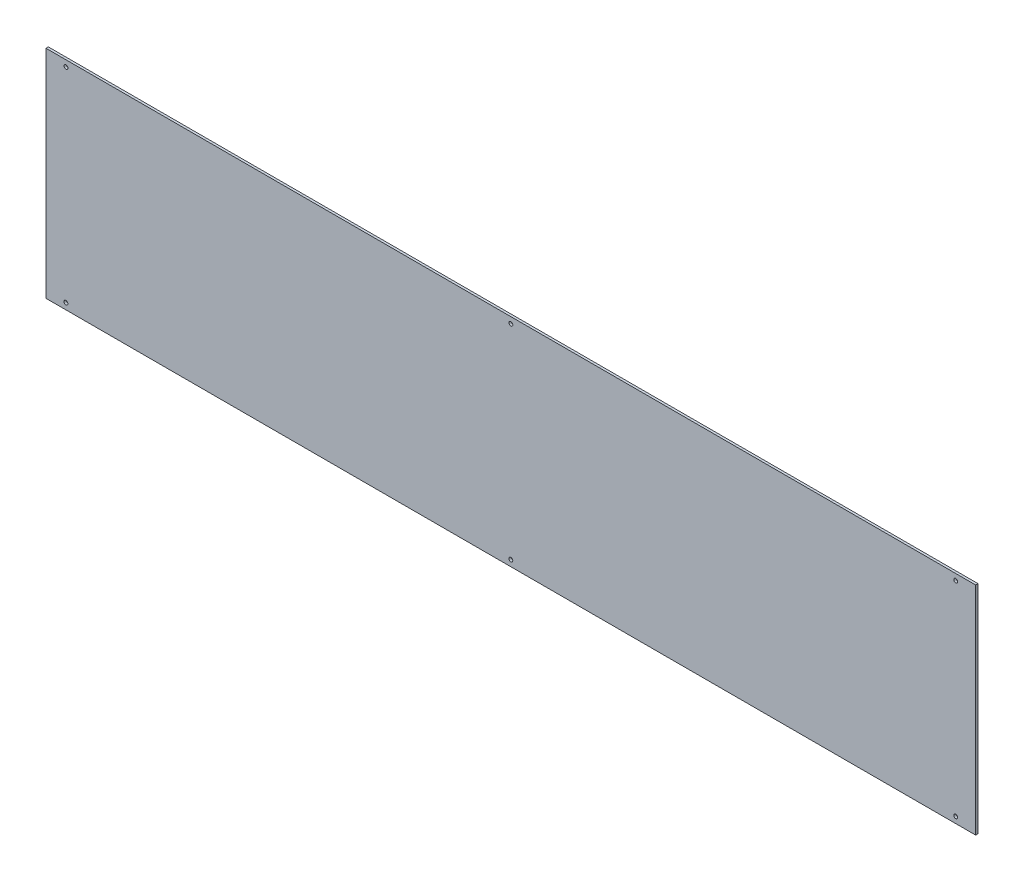
ISO-10303-21;
HEADER;
FILE_DESCRIPTION(('STEP AP214'),'2;1');
FILE_NAME('part.step','',(''),(''),'','','');
FILE_SCHEMA(('AUTOMOTIVE_DESIGN { 1 0 10303 214 1 1 1 1 }'));
ENDSEC;
DATA;
#1=APPLICATION_CONTEXT('core data for automotive mechanical design processes');
#2=APPLICATION_PROTOCOL_DEFINITION('international standard','automotive_design',2000,#1);
#3=PRODUCT_CONTEXT('',#1,'mechanical');
#4=PRODUCT('Part','Part','',(#3));
#5=PRODUCT_RELATED_PRODUCT_CATEGORY('part','',(#4));
#6=PRODUCT_DEFINITION_FORMATION('','',#4);
#7=PRODUCT_DEFINITION_CONTEXT('part definition',#1,'design');
#8=PRODUCT_DEFINITION('design','',#6,#7);
#9=PRODUCT_DEFINITION_SHAPE('','',#8);
#10=(LENGTH_UNIT() NAMED_UNIT(*) SI_UNIT(.MILLI.,.METRE.));
#11=(NAMED_UNIT(*) PLANE_ANGLE_UNIT() SI_UNIT($,.RADIAN.));
#12=(NAMED_UNIT(*) SI_UNIT($,.STERADIAN.) SOLID_ANGLE_UNIT());
#13=UNCERTAINTY_MEASURE_WITH_UNIT(LENGTH_MEASURE(1.E-05),#10,'distance_accuracy_value','');
#14=(GEOMETRIC_REPRESENTATION_CONTEXT(3) GLOBAL_UNCERTAINTY_ASSIGNED_CONTEXT((#13)) GLOBAL_UNIT_ASSIGNED_CONTEXT((#10,
#11,#12)) REPRESENTATION_CONTEXT('',''));
#15=CARTESIAN_POINT('',(0.,0.,0.));
#16=DIRECTION('',(0.,0.,1.));
#17=DIRECTION('',(1.,0.,0.));
#18=AXIS2_PLACEMENT_3D('',#15,#16,#17);
#19=CARTESIAN_POINT('',(-592.709,138.1125,0.));
#20=DIRECTION('',(0.,0.,1.));
#21=DIRECTION('',(1.,0.,0.));
#22=AXIS2_PLACEMENT_3D('',#19,#20,#21);
#23=PLANE('',#22);
#24=DIRECTION('',(1.,0.,0.));
#25=VECTOR('',#24,1.);
#26=CARTESIAN_POINT('',(592.709,138.1125,0.));
#27=LINE('',#26,#25);
#28=CARTESIAN_POINT('',(-592.709,138.1125,0.));
#29=VERTEX_POINT('',#28);
#30=CARTESIAN_POINT('',(592.709,138.1125,0.));
#31=VERTEX_POINT('',#30);
#32=EDGE_CURVE('E102',#29,#31,#27,.T.);
#33=ORIENTED_EDGE('',*,*,#32,.T.);
#34=DIRECTION('',(0.,1.,0.));
#35=VECTOR('',#34,1.);
#36=CARTESIAN_POINT('',(592.709,-138.1125,0.));
#37=LINE('',#36,#35);
#38=CARTESIAN_POINT('',(592.709,-138.1125,0.));
#39=VERTEX_POINT('',#38);
#40=EDGE_CURVE('E72',#31,#39,#37,.F.);
#41=ORIENTED_EDGE('',*,*,#40,.T.);
#42=DIRECTION('',(-1.,0.,0.));
#43=VECTOR('',#42,1.);
#44=CARTESIAN_POINT('',(592.709,-138.1125,0.));
#45=LINE('',#44,#43);
#46=CARTESIAN_POINT('',(-592.709,-138.1125,0.));
#47=VERTEX_POINT('',#46);
#48=EDGE_CURVE('E55',#39,#47,#45,.T.);
#49=ORIENTED_EDGE('',*,*,#48,.T.);
#50=DIRECTION('',(0.,1.,0.));
#51=VECTOR('',#50,1.);
#52=CARTESIAN_POINT('',(-592.709,-138.1125,0.));
#53=LINE('',#52,#51);
#54=EDGE_CURVE('E60',#47,#29,#53,.T.);
#55=ORIENTED_EDGE('',*,*,#54,.T.);
#56=EDGE_LOOP('',(#33,#41,#49,#55));
#57=FACE_BOUND('',#56,.T.);
#58=CARTESIAN_POINT('',(0.,130.175,0.));
#59=DIRECTION('',(0.,0.,1.));
#60=DIRECTION('',(1.,0.,0.));
#61=AXIS2_PLACEMENT_3D('',#58,#59,#60);
#62=CIRCLE('',#61,2.4892);
#63=CARTESIAN_POINT('',(2.4892,130.175,0.));
#64=VERTEX_POINT('',#63);
#65=EDGE_CURVE('E69',#64,#64,#62,.T.);
#66=ORIENTED_EDGE('',*,*,#65,.T.);
#67=EDGE_LOOP('',(#66));
#68=FACE_BOUND('',#67,.T.);
#69=CARTESIAN_POINT('',(0.,-130.175,0.));
#70=DIRECTION('',(0.,0.,1.));
#71=DIRECTION('',(1.,0.,0.));
#72=AXIS2_PLACEMENT_3D('',#69,#70,#71);
#73=CIRCLE('',#72,2.4892);
#74=CARTESIAN_POINT('',(2.4892,-130.175,0.));
#75=VERTEX_POINT('',#74);
#76=EDGE_CURVE('E105',#75,#75,#73,.T.);
#77=ORIENTED_EDGE('',*,*,#76,.T.);
#78=EDGE_LOOP('',(#77));
#79=FACE_BOUND('',#78,.T.);
#80=CARTESIAN_POINT('',(-567.309,-130.175,0.));
#81=DIRECTION('',(0.,0.,1.));
#82=DIRECTION('',(1.,0.,0.));
#83=AXIS2_PLACEMENT_3D('',#80,#81,#82);
#84=CIRCLE('',#83,2.48919999999997);
#85=CARTESIAN_POINT('',(-564.8198,-130.175,0.));
#86=VERTEX_POINT('',#85);
#87=EDGE_CURVE('E108',#86,#86,#84,.T.);
#88=ORIENTED_EDGE('',*,*,#87,.T.);
#89=EDGE_LOOP('',(#88));
#90=FACE_BOUND('',#89,.T.);
#91=CARTESIAN_POINT('',(567.309,-130.175,0.));
#92=DIRECTION('',(0.,0.,1.));
#93=DIRECTION('',(1.,0.,0.));
#94=AXIS2_PLACEMENT_3D('',#91,#92,#93);
#95=CIRCLE('',#94,2.48919999999997);
#96=CARTESIAN_POINT('',(569.7982,-130.175,0.));
#97=VERTEX_POINT('',#96);
#98=EDGE_CURVE('E111',#97,#97,#95,.T.);
#99=ORIENTED_EDGE('',*,*,#98,.T.);
#100=EDGE_LOOP('',(#99));
#101=FACE_BOUND('',#100,.T.);
#102=CARTESIAN_POINT('',(567.309,130.175,0.));
#103=DIRECTION('',(0.,0.,1.));
#104=DIRECTION('',(1.,0.,0.));
#105=AXIS2_PLACEMENT_3D('',#102,#103,#104);
#106=CIRCLE('',#105,2.48919999999997);
#107=CARTESIAN_POINT('',(569.7982,130.175,0.));
#108=VERTEX_POINT('',#107);
#109=EDGE_CURVE('E113',#108,#108,#106,.T.);
#110=ORIENTED_EDGE('',*,*,#109,.T.);
#111=EDGE_LOOP('',(#110));
#112=FACE_BOUND('',#111,.T.);
#113=CARTESIAN_POINT('',(-567.309,130.175,0.));
#114=DIRECTION('',(0.,0.,1.));
#115=DIRECTION('',(1.,0.,0.));
#116=AXIS2_PLACEMENT_3D('',#113,#114,#115);
#117=CIRCLE('',#116,2.48919999999997);
#118=CARTESIAN_POINT('',(-564.8198,130.175,0.));
#119=VERTEX_POINT('',#118);
#120=EDGE_CURVE('E20',#119,#119,#117,.T.);
#121=ORIENTED_EDGE('',*,*,#120,.T.);
#122=EDGE_LOOP('',(#121));
#123=FACE_BOUND('',#122,.T.);
#124=ADVANCED_FACE('F17',(#57,#68,#79,#90,#101,#112,#123),#23,.F.);
#125=CARTESIAN_POINT('',(-567.309,130.175,0.));
#126=DIRECTION('',(0.,0.,1.));
#127=DIRECTION('',(1.,0.,0.));
#128=AXIS2_PLACEMENT_3D('',#125,#126,#127);
#129=CYLINDRICAL_SURFACE('',#128,2.48919999999997);
#130=CARTESIAN_POINT('',(-567.309,130.175,2.9972));
#131=DIRECTION('',(0.,0.,1.));
#132=DIRECTION('',(1.,0.,0.));
#133=AXIS2_PLACEMENT_3D('',#130,#131,#132);
#134=CIRCLE('',#133,2.48919999999997);
#135=CARTESIAN_POINT('',(-564.8198,130.175,2.9972));
#136=VERTEX_POINT('',#135);
#137=EDGE_CURVE('E99',#136,#136,#134,.F.);
#138=ORIENTED_EDGE('',*,*,#137,.F.);
#139=EDGE_LOOP('',(#138));
#140=FACE_BOUND('',#139,.T.);
#141=ORIENTED_EDGE('',*,*,#120,.F.);
#142=EDGE_LOOP('',(#141));
#143=FACE_BOUND('',#142,.T.);
#144=ADVANCED_FACE('F121',(#140,#143),#129,.F.);
#145=CARTESIAN_POINT('',(567.309,130.175,0.));
#146=DIRECTION('',(0.,0.,1.));
#147=DIRECTION('',(1.,0.,0.));
#148=AXIS2_PLACEMENT_3D('',#145,#146,#147);
#149=CYLINDRICAL_SURFACE('',#148,2.48919999999997);
#150=CARTESIAN_POINT('',(567.309,130.175,2.9972));
#151=DIRECTION('',(0.,0.,1.));
#152=DIRECTION('',(1.,0.,0.));
#153=AXIS2_PLACEMENT_3D('',#150,#151,#152);
#154=CIRCLE('',#153,2.48919999999997);
#155=CARTESIAN_POINT('',(569.7982,130.175,2.9972));
#156=VERTEX_POINT('',#155);
#157=EDGE_CURVE('E96',#156,#156,#154,.F.);
#158=ORIENTED_EDGE('',*,*,#157,.F.);
#159=EDGE_LOOP('',(#158));
#160=FACE_BOUND('',#159,.T.);
#161=ORIENTED_EDGE('',*,*,#109,.F.);
#162=EDGE_LOOP('',(#161));
#163=FACE_BOUND('',#162,.T.);
#164=ADVANCED_FACE('F123',(#160,#163),#149,.F.);
#165=CARTESIAN_POINT('',(567.309,-130.175,0.));
#166=DIRECTION('',(0.,0.,1.));
#167=DIRECTION('',(1.,0.,0.));
#168=AXIS2_PLACEMENT_3D('',#165,#166,#167);
#169=CYLINDRICAL_SURFACE('',#168,2.48919999999997);
#170=CARTESIAN_POINT('',(567.309,-130.175,2.9972));
#171=DIRECTION('',(0.,0.,1.));
#172=DIRECTION('',(1.,0.,0.));
#173=AXIS2_PLACEMENT_3D('',#170,#171,#172);
#174=CIRCLE('',#173,2.48919999999997);
#175=CARTESIAN_POINT('',(569.7982,-130.175,2.9972));
#176=VERTEX_POINT('',#175);
#177=EDGE_CURVE('E93',#176,#176,#174,.F.);
#178=ORIENTED_EDGE('',*,*,#177,.F.);
#179=EDGE_LOOP('',(#178));
#180=FACE_BOUND('',#179,.T.);
#181=ORIENTED_EDGE('',*,*,#98,.F.);
#182=EDGE_LOOP('',(#181));
#183=FACE_BOUND('',#182,.T.);
#184=ADVANCED_FACE('F130',(#180,#183),#169,.F.);
#185=CARTESIAN_POINT('',(-567.309,-130.175,0.));
#186=DIRECTION('',(0.,0.,1.));
#187=DIRECTION('',(1.,0.,0.));
#188=AXIS2_PLACEMENT_3D('',#185,#186,#187);
#189=CYLINDRICAL_SURFACE('',#188,2.48919999999997);
#190=CARTESIAN_POINT('',(-567.309,-130.175,2.9972));
#191=DIRECTION('',(0.,0.,1.));
#192=DIRECTION('',(1.,0.,0.));
#193=AXIS2_PLACEMENT_3D('',#190,#191,#192);
#194=CIRCLE('',#193,2.48919999999997);
#195=CARTESIAN_POINT('',(-564.8198,-130.175,2.9972));
#196=VERTEX_POINT('',#195);
#197=EDGE_CURVE('E90',#196,#196,#194,.F.);
#198=ORIENTED_EDGE('',*,*,#197,.F.);
#199=EDGE_LOOP('',(#198));
#200=FACE_BOUND('',#199,.T.);
#201=ORIENTED_EDGE('',*,*,#87,.F.);
#202=EDGE_LOOP('',(#201));
#203=FACE_BOUND('',#202,.T.);
#204=ADVANCED_FACE('F161',(#200,#203),#189,.F.);
#205=CARTESIAN_POINT('',(0.,-130.175,0.));
#206=DIRECTION('',(0.,0.,1.));
#207=DIRECTION('',(1.,0.,0.));
#208=AXIS2_PLACEMENT_3D('',#205,#206,#207);
#209=CYLINDRICAL_SURFACE('',#208,2.4892);
#210=CARTESIAN_POINT('',(0.,-130.175,2.9972));
#211=DIRECTION('',(0.,0.,1.));
#212=DIRECTION('',(1.,0.,0.));
#213=AXIS2_PLACEMENT_3D('',#210,#211,#212);
#214=CIRCLE('',#213,2.4892);
#215=CARTESIAN_POINT('',(2.4892,-130.175,2.9972));
#216=VERTEX_POINT('',#215);
#217=EDGE_CURVE('E87',#216,#216,#214,.F.);
#218=ORIENTED_EDGE('',*,*,#217,.F.);
#219=EDGE_LOOP('',(#218));
#220=FACE_BOUND('',#219,.T.);
#221=ORIENTED_EDGE('',*,*,#76,.F.);
#222=EDGE_LOOP('',(#221));
#223=FACE_BOUND('',#222,.T.);
#224=ADVANCED_FACE('F157',(#220,#223),#209,.F.);
#225=CARTESIAN_POINT('',(0.,130.175,0.));
#226=DIRECTION('',(0.,0.,1.));
#227=DIRECTION('',(1.,0.,0.));
#228=AXIS2_PLACEMENT_3D('',#225,#226,#227);
#229=CYLINDRICAL_SURFACE('',#228,2.4892);
#230=CARTESIAN_POINT('',(0.,130.175,2.9972));
#231=DIRECTION('',(0.,0.,1.));
#232=DIRECTION('',(1.,0.,0.));
#233=AXIS2_PLACEMENT_3D('',#230,#231,#232);
#234=CIRCLE('',#233,2.4892);
#235=CARTESIAN_POINT('',(2.4892,130.175,2.9972));
#236=VERTEX_POINT('',#235);
#237=EDGE_CURVE('E83',#236,#236,#234,.F.);
#238=ORIENTED_EDGE('',*,*,#237,.F.);
#239=EDGE_LOOP('',(#238));
#240=FACE_BOUND('',#239,.T.);
#241=ORIENTED_EDGE('',*,*,#65,.F.);
#242=EDGE_LOOP('',(#241));
#243=FACE_BOUND('',#242,.T.);
#244=ADVANCED_FACE('F154',(#240,#243),#229,.F.);
#245=CARTESIAN_POINT('',(-592.709,-138.1125,2.9972));
#246=DIRECTION('',(1.,0.,0.));
#247=DIRECTION('',(0.,0.,-1.));
#248=AXIS2_PLACEMENT_3D('',#245,#246,#247);
#249=PLANE('',#248);
#250=DIRECTION('',(0.,0.,1.));
#251=VECTOR('',#250,1.);
#252=CARTESIAN_POINT('',(-592.709,-138.1125,2.9972));
#253=LINE('',#252,#251);
#254=CARTESIAN_POINT('',(-592.709,-138.1125,2.9972));
#255=VERTEX_POINT('',#254);
#256=EDGE_CURVE('E62',#47,#255,#253,.T.);
#257=ORIENTED_EDGE('',*,*,#256,.T.);
#258=DIRECTION('',(0.,1.,0.));
#259=VECTOR('',#258,1.);
#260=CARTESIAN_POINT('',(-592.709,138.1125,2.9972));
#261=LINE('',#260,#259);
#262=CARTESIAN_POINT('',(-592.709,138.1125,2.9972));
#263=VERTEX_POINT('',#262);
#264=EDGE_CURVE('E86',#263,#255,#261,.F.);
#265=ORIENTED_EDGE('',*,*,#264,.F.);
#266=DIRECTION('',(0.,0.,1.));
#267=VECTOR('',#266,1.);
#268=CARTESIAN_POINT('',(-592.709,138.1125,2.9972));
#269=LINE('',#268,#267);
#270=EDGE_CURVE('E65',#263,#29,#269,.F.);
#271=ORIENTED_EDGE('',*,*,#270,.T.);
#272=ORIENTED_EDGE('',*,*,#54,.F.);
#273=EDGE_LOOP('',(#257,#265,#271,#272));
#274=FACE_BOUND('',#273,.T.);
#275=ADVANCED_FACE('F61',(#274),#249,.F.);
#276=CARTESIAN_POINT('',(592.709,-138.1125,2.9972));
#277=DIRECTION('',(0.,1.,0.));
#278=DIRECTION('',(-1.,0.,0.));
#279=AXIS2_PLACEMENT_3D('',#276,#277,#278);
#280=PLANE('',#279);
#281=DIRECTION('',(0.,0.,1.));
#282=VECTOR('',#281,1.);
#283=CARTESIAN_POINT('',(592.709,-138.1125,2.9972));
#284=LINE('',#283,#282);
#285=CARTESIAN_POINT('',(592.709,-138.1125,2.9972));
#286=VERTEX_POINT('',#285);
#287=EDGE_CURVE('E74',#39,#286,#284,.T.);
#288=ORIENTED_EDGE('',*,*,#287,.T.);
#289=DIRECTION('',(1.,0.,0.));
#290=VECTOR('',#289,1.);
#291=CARTESIAN_POINT('',(-592.709,-138.1125,2.9972));
#292=LINE('',#291,#290);
#293=EDGE_CURVE('E78',#255,#286,#292,.T.);
#294=ORIENTED_EDGE('',*,*,#293,.F.);
#295=ORIENTED_EDGE('',*,*,#256,.F.);
#296=ORIENTED_EDGE('',*,*,#48,.F.);
#297=EDGE_LOOP('',(#288,#294,#295,#296));
#298=FACE_BOUND('',#297,.T.);
#299=ADVANCED_FACE('F76',(#298),#280,.F.);
#300=CARTESIAN_POINT('',(592.709,-138.1125,2.9972));
#301=DIRECTION('',(-1.,0.,0.));
#302=DIRECTION('',(0.,0.,1.));
#303=AXIS2_PLACEMENT_3D('',#300,#301,#302);
#304=PLANE('',#303);
#305=DIRECTION('',(0.,0.,1.));
#306=VECTOR('',#305,1.);
#307=CARTESIAN_POINT('',(592.709,138.1125,2.9972));
#308=LINE('',#307,#306);
#309=CARTESIAN_POINT('',(592.709,138.1125,2.9972));
#310=VERTEX_POINT('',#309);
#311=EDGE_CURVE('E35',#31,#310,#308,.T.);
#312=ORIENTED_EDGE('',*,*,#311,.T.);
#313=DIRECTION('',(0.,1.,0.));
#314=VECTOR('',#313,1.);
#315=CARTESIAN_POINT('',(592.709,138.1125,2.9972));
#316=LINE('',#315,#314);
#317=EDGE_CURVE('E26',#286,#310,#316,.T.);
#318=ORIENTED_EDGE('',*,*,#317,.F.);
#319=ORIENTED_EDGE('',*,*,#287,.F.);
#320=ORIENTED_EDGE('',*,*,#40,.F.);
#321=EDGE_LOOP('',(#312,#318,#319,#320));
#322=FACE_BOUND('',#321,.T.);
#323=ADVANCED_FACE('F142',(#322),#304,.F.);
#324=CARTESIAN_POINT('',(592.709,138.1125,2.9972));
#325=DIRECTION('',(0.,-1.,0.));
#326=DIRECTION('',(1.,0.,0.));
#327=AXIS2_PLACEMENT_3D('',#324,#325,#326);
#328=PLANE('',#327);
#329=ORIENTED_EDGE('',*,*,#270,.F.);
#330=DIRECTION('',(1.,0.,0.));
#331=VECTOR('',#330,1.);
#332=CARTESIAN_POINT('',(-592.709,138.1125,2.9972));
#333=LINE('',#332,#331);
#334=EDGE_CURVE('E11',#310,#263,#333,.F.);
#335=ORIENTED_EDGE('',*,*,#334,.F.);
#336=ORIENTED_EDGE('',*,*,#311,.F.);
#337=ORIENTED_EDGE('',*,*,#32,.F.);
#338=EDGE_LOOP('',(#329,#335,#336,#337));
#339=FACE_BOUND('',#338,.T.);
#340=ADVANCED_FACE('F136',(#339),#328,.F.);
#341=CARTESIAN_POINT('',(-592.709,138.1125,2.9972));
#342=DIRECTION('',(0.,0.,1.));
#343=DIRECTION('',(1.,0.,0.));
#344=AXIS2_PLACEMENT_3D('',#341,#342,#343);
#345=PLANE('',#344);
#346=ORIENTED_EDGE('',*,*,#317,.T.);
#347=ORIENTED_EDGE('',*,*,#334,.T.);
#348=ORIENTED_EDGE('',*,*,#264,.T.);
#349=ORIENTED_EDGE('',*,*,#293,.T.);
#350=EDGE_LOOP('',(#346,#347,#348,#349));
#351=FACE_BOUND('',#350,.T.);
#352=ORIENTED_EDGE('',*,*,#237,.T.);
#353=EDGE_LOOP('',(#352));
#354=FACE_BOUND('',#353,.T.);
#355=ORIENTED_EDGE('',*,*,#217,.T.);
#356=EDGE_LOOP('',(#355));
#357=FACE_BOUND('',#356,.T.);
#358=ORIENTED_EDGE('',*,*,#197,.T.);
#359=EDGE_LOOP('',(#358));
#360=FACE_BOUND('',#359,.T.);
#361=ORIENTED_EDGE('',*,*,#177,.T.);
#362=EDGE_LOOP('',(#361));
#363=FACE_BOUND('',#362,.T.);
#364=ORIENTED_EDGE('',*,*,#157,.T.);
#365=EDGE_LOOP('',(#364));
#366=FACE_BOUND('',#365,.T.);
#367=ORIENTED_EDGE('',*,*,#137,.T.);
#368=EDGE_LOOP('',(#367));
#369=FACE_BOUND('',#368,.T.);
#370=ADVANCED_FACE('F134',(#351,#354,#357,#360,#363,#366,#369),#345,.T.);
#371=CLOSED_SHELL('',(#124,#144,#164,#184,#204,#224,#244,#275,#299,#323,#340,#370));
#372=MANIFOLD_SOLID_BREP('B1',#371);
#373=ADVANCED_BREP_SHAPE_REPRESENTATION('',(#18,#372),#14);
#374=SHAPE_DEFINITION_REPRESENTATION(#9,#373);
ENDSEC;
END-ISO-10303-21;
